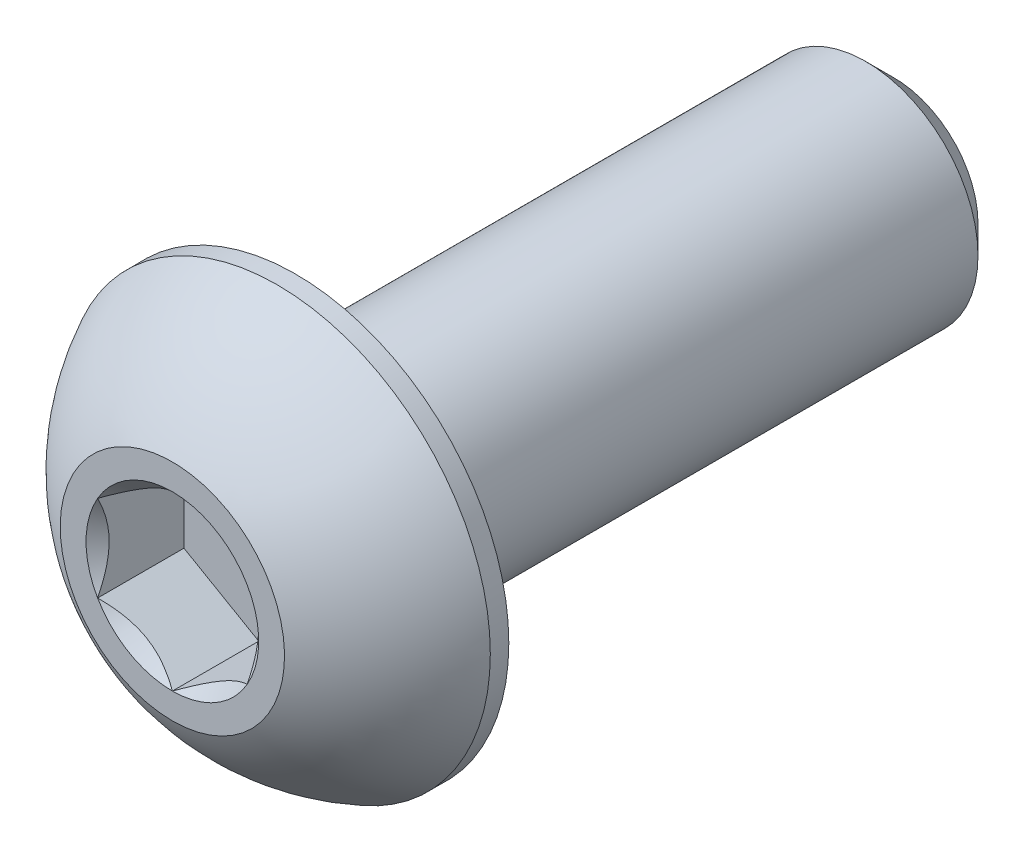
ISO-10303-21;
HEADER;
FILE_DESCRIPTION(('STEP AP214'),'2;1');
FILE_NAME('part.step','',(''),(''),'','','');
FILE_SCHEMA(('AUTOMOTIVE_DESIGN { 1 0 10303 214 1 1 1 1 }'));
ENDSEC;
DATA;
#1=APPLICATION_CONTEXT('core data for automotive mechanical design processes');
#2=APPLICATION_PROTOCOL_DEFINITION('international standard','automotive_design',2000,#1);
#3=PRODUCT_CONTEXT('',#1,'mechanical');
#4=PRODUCT('Part','Part','',(#3));
#5=PRODUCT_RELATED_PRODUCT_CATEGORY('part','',(#4));
#6=PRODUCT_DEFINITION_FORMATION('','',#4);
#7=PRODUCT_DEFINITION_CONTEXT('part definition',#1,'design');
#8=PRODUCT_DEFINITION('design','',#6,#7);
#9=PRODUCT_DEFINITION_SHAPE('','',#8);
#10=(LENGTH_UNIT() NAMED_UNIT(*) SI_UNIT(.MILLI.,.METRE.));
#11=(NAMED_UNIT(*) PLANE_ANGLE_UNIT() SI_UNIT($,.RADIAN.));
#12=(NAMED_UNIT(*) SI_UNIT($,.STERADIAN.) SOLID_ANGLE_UNIT());
#13=UNCERTAINTY_MEASURE_WITH_UNIT(LENGTH_MEASURE(1.E-05),#10,'distance_accuracy_value','');
#14=(GEOMETRIC_REPRESENTATION_CONTEXT(3) GLOBAL_UNCERTAINTY_ASSIGNED_CONTEXT((#13)) GLOBAL_UNIT_ASSIGNED_CONTEXT((#10,
#11,#12)) REPRESENTATION_CONTEXT('',''));
#15=CARTESIAN_POINT('',(0.,0.,0.));
#16=DIRECTION('',(0.,0.,1.));
#17=DIRECTION('',(1.,0.,0.));
#18=AXIS2_PLACEMENT_3D('',#15,#16,#17);
#19=CARTESIAN_POINT('',(0.,0.,-9.65000000000001));
#20=DIRECTION('',(0.,0.,1.));
#21=DIRECTION('',(1.,0.,0.));
#22=AXIS2_PLACEMENT_3D('',#19,#20,#21);
#23=PLANE('',#22);
#24=CARTESIAN_POINT('',(0.,0.,-9.65000000000001));
#25=DIRECTION('',(0.,0.,1.));
#26=DIRECTION('',(1.,0.,0.));
#27=AXIS2_PLACEMENT_3D('',#24,#25,#26);
#28=CIRCLE('',#27,1.12500000000003);
#29=CARTESIAN_POINT('',(1.12500000000003,0.,-9.65000000000001));
#30=VERTEX_POINT('',#29);
#31=EDGE_CURVE('E51',#30,#30,#28,.T.);
#32=ORIENTED_EDGE('',*,*,#31,.F.);
#33=EDGE_LOOP('',(#32));
#34=FACE_BOUND('',#33,.T.);
#35=ADVANCED_FACE('F38',(#34),#23,.F.);
#36=CARTESIAN_POINT('',(0.,0.,-9.65000000000001));
#37=DIRECTION('',(0.,0.,1.));
#38=DIRECTION('',(1.,0.,0.));
#39=AXIS2_PLACEMENT_3D('',#36,#37,#38);
#40=CONICAL_SURFACE('',#39,1.12500000000003,0.785398163397431);
#41=CARTESIAN_POINT('',(0.,0.,-9.27500000000001));
#42=DIRECTION('',(0.,0.,1.));
#43=DIRECTION('',(1.,0.,0.));
#44=AXIS2_PLACEMENT_3D('',#41,#42,#43);
#45=CIRCLE('',#44,1.50000000000002);
#46=CARTESIAN_POINT('',(1.50000000000002,0.,-9.27500000000001));
#47=VERTEX_POINT('',#46);
#48=EDGE_CURVE('E177',#47,#47,#45,.T.);
#49=ORIENTED_EDGE('',*,*,#48,.F.);
#50=EDGE_LOOP('',(#49));
#51=FACE_BOUND('',#50,.T.);
#52=ORIENTED_EDGE('',*,*,#31,.T.);
#53=EDGE_LOOP('',(#52));
#54=FACE_BOUND('',#53,.T.);
#55=ADVANCED_FACE('F182',(#51,#54),#40,.T.);
#56=CARTESIAN_POINT('',(0.,0.,0.));
#57=DIRECTION('',(0.,0.,1.));
#58=DIRECTION('',(1.,0.,0.));
#59=AXIS2_PLACEMENT_3D('',#56,#57,#58);
#60=CYLINDRICAL_SURFACE('',#59,1.50000000000002);
#61=CARTESIAN_POINT('',(0.,0.,-1.65));
#62=DIRECTION('',(0.,0.,1.));
#63=DIRECTION('',(1.,0.,0.));
#64=AXIS2_PLACEMENT_3D('',#61,#62,#63);
#65=CIRCLE('',#64,1.50000000000002);
#66=CARTESIAN_POINT('',(1.50000000000002,0.,-1.65));
#67=VERTEX_POINT('',#66);
#68=EDGE_CURVE('E174',#67,#67,#65,.T.);
#69=ORIENTED_EDGE('',*,*,#68,.F.);
#70=EDGE_LOOP('',(#69));
#71=FACE_BOUND('',#70,.T.);
#72=ORIENTED_EDGE('',*,*,#48,.T.);
#73=EDGE_LOOP('',(#72));
#74=FACE_BOUND('',#73,.T.);
#75=ADVANCED_FACE('F188',(#71,#74),#60,.T.);
#76=CARTESIAN_POINT('',(0.,-2.85,-1.65));
#77=DIRECTION('',(0.,0.,1.));
#78=DIRECTION('',(1.,0.,0.));
#79=AXIS2_PLACEMENT_3D('',#76,#77,#78);
#80=PLANE('',#79);
#81=CARTESIAN_POINT('',(0.,0.,-1.65));
#82=DIRECTION('',(0.,0.,1.));
#83=DIRECTION('',(1.,0.,0.));
#84=AXIS2_PLACEMENT_3D('',#81,#82,#83);
#85=CIRCLE('',#84,2.85);
#86=CARTESIAN_POINT('',(2.85,0.,-1.65));
#87=VERTEX_POINT('',#86);
#88=EDGE_CURVE('E168',#87,#87,#85,.T.);
#89=ORIENTED_EDGE('',*,*,#88,.F.);
#90=EDGE_LOOP('',(#89));
#91=FACE_BOUND('',#90,.T.);
#92=ORIENTED_EDGE('',*,*,#68,.T.);
#93=EDGE_LOOP('',(#92));
#94=FACE_BOUND('',#93,.T.);
#95=ADVANCED_FACE('F193',(#91,#94),#80,.F.);
#96=CARTESIAN_POINT('',(0.,0.,-2.79483288770053));
#97=DIRECTION('',(0.,0.,1.));
#98=DIRECTION('',(0.,-1.,0.));
#99=AXIS2_PLACEMENT_3D('',#96,#97,#98);
#100=SPHERICAL_SURFACE('',#99,3.17192226735975);
#101=CARTESIAN_POINT('',(0.,0.,0.));
#102=DIRECTION('',(0.,0.,1.));
#103=DIRECTION('',(1.,0.,0.));
#104=AXIS2_PLACEMENT_3D('',#101,#102,#103);
#105=CIRCLE('',#104,1.50000000000002);
#106=CARTESIAN_POINT('',(0.,-1.50000000000002,0.));
#107=VERTEX_POINT('',#106);
#108=EDGE_CURVE('E171',#107,#107,#105,.T.);
#109=CARTESIAN_POINT('',(0.,0.,-1.4025));
#110=DIRECTION('',(0.,0.,1.));
#111=DIRECTION('',(1.,0.,0.));
#112=AXIS2_PLACEMENT_3D('',#109,#110,#111);
#113=CIRCLE('',#112,2.85);
#114=CARTESIAN_POINT('',(0.,-2.85,-1.4025));
#115=VERTEX_POINT('',#114);
#116=EDGE_CURVE('E165',#115,#115,#113,.T.);
#117=CARTESIAN_POINT('',(0.,-1.50000000000002,0.));
#118=CARTESIAN_POINT('',(0.,-1.51816007989212,-0.009746569473365));
#119=CARTESIAN_POINT('',(0.,-1.53622513742982,-0.0196701847238474));
#120=CARTESIAN_POINT('',(0.,-1.57215840256596,-0.039867631129312));
#121=CARTESIAN_POINT('',(0.,-1.59002661016439,-0.0501414622842942));
#122=CARTESIAN_POINT('',(0.,-1.62555937019151,-0.0710354648490238));
#123=CARTESIAN_POINT('',(0.,-1.64322392262021,-0.0816556362587711));
#124=CARTESIAN_POINT('',(0.,-1.67834266450263,-0.103238276426968));
#125=CARTESIAN_POINT('',(0.,-1.69579685395637,-0.114200745185417));
#126=CARTESIAN_POINT('',(0.,-1.73048823664555,-0.136463816635607));
#127=CARTESIAN_POINT('',(0.,-1.747725429881,-0.147764419327348));
#128=CARTESIAN_POINT('',(0.,-1.78197627078177,-0.170699464187154));
#129=CARTESIAN_POINT('',(0.,-1.7989899184471,-0.18233390635522));
#130=CARTESIAN_POINT('',(0.,-1.83278720341136,-0.205932209546913));
#131=CARTESIAN_POINT('',(0.,-1.84957084071029,-0.217896070570541));
#132=CARTESIAN_POINT('',(0.,-1.88290172764637,-0.242148665498755));
#133=CARTESIAN_POINT('',(0.,-1.89944897728351,-0.254437399403342));
#134=CARTESIAN_POINT('',(0.,-1.9323008013937,-0.279335070725424));
#135=CARTESIAN_POINT('',(0.,-1.94860537586674,-0.291944008142921));
#136=CARTESIAN_POINT('',(0.,-1.98096565436366,-0.317477295441113));
#137=CARTESIAN_POINT('',(0.,-1.99702135838754,-0.330401645321808));
#138=CARTESIAN_POINT('',(0.,-2.02887779526297,-0.356560846652227));
#139=CARTESIAN_POINT('',(0.,-2.04467852811453,-0.36979569810195));
#140=CARTESIAN_POINT('',(0.,-2.07601901880465,-0.396570873693308));
#141=CARTESIAN_POINT('',(0.,-2.09155877664322,-0.410111197834944));
#142=CARTESIAN_POINT('',(0.,-2.12237141262986,-0.437492173862107));
#143=CARTESIAN_POINT('',(0.,-2.13764429077792,-0.451332825747635));
#144=CARTESIAN_POINT('',(0.,-2.16791736411296,-0.479309198198269));
#145=CARTESIAN_POINT('',(0.,-2.18291755929994,-0.493444918763376));
#146=CARTESIAN_POINT('',(0.,-2.21263956705415,-0.522006057390952));
#147=CARTESIAN_POINT('',(0.,-2.2273613796214,-0.53643147545342));
#148=CARTESIAN_POINT('',(0.,-2.25652102825521,-0.565566527816472));
#149=CARTESIAN_POINT('',(0.,-2.27095886432178,-0.580276162117056));
#150=CARTESIAN_POINT('',(0.,-2.2995450739765,-0.609974057702796));
#151=CARTESIAN_POINT('',(0.,-2.31369344756466,-0.624962318987953));
#152=CARTESIAN_POINT('',(0.,-2.34169535627252,-0.65521177341876));
#153=CARTESIAN_POINT('',(0.,-2.35554889139224,-0.670472966564411));
#154=CARTESIAN_POINT('',(0.,-2.38295585920366,-0.701262485885584));
#155=CARTESIAN_POINT('',(0.,-2.39650929189537,-0.716790812061106));
#156=CARTESIAN_POINT('',(0.,-2.42331090492182,-0.748108697108243));
#157=CARTESIAN_POINT('',(0.,-2.43655908525657,-0.763898255979859));
#158=CARTESIAN_POINT('',(0.,-2.46274515962755,-0.795732606824228));
#159=CARTESIAN_POINT('',(0.,-2.47568305366379,-0.811777398796981));
#160=CARTESIAN_POINT('',(0.,-2.50124363939651,-0.844116119267127));
#161=CARTESIAN_POINT('',(0.,-2.51386633109298,-0.86041004776452));
#162=CARTESIAN_POINT('',(0.,-2.53879171587279,-0.8932408500426));
#163=CARTESIAN_POINT('',(0.,-2.55109440895612,-0.909777723823287));
#164=CARTESIAN_POINT('',(0.,-2.57537512182785,-0.94308813311364));
#165=CARTESIAN_POINT('',(0.,-2.58735314161625,-0.959861668623306));
#166=CARTESIAN_POINT('',(0.,-2.61097995657956,-0.993639027894247));
#167=CARTESIAN_POINT('',(0.,-2.62262875175448,-1.01064285165552));
#168=CARTESIAN_POINT('',(0.,-2.64559269128199,-1.04487432644225));
#169=CARTESIAN_POINT('',(0.,-2.65690783563458,-1.06210197746771));
#170=CARTESIAN_POINT('',(0.,-2.67920017403639,-1.09677456077299));
#171=CARTESIAN_POINT('',(0.,-2.69017736808561,-1.11421949305282));
#172=CARTESIAN_POINT('',(0.,-2.711789634999,-1.14932001019995));
#173=CARTESIAN_POINT('',(0.,-2.72242470786316,-1.16697559506725));
#174=CARTESIAN_POINT('',(0.,-2.74334869082118,-1.20249070903943));
#175=CARTESIAN_POINT('',(0.,-2.75363760091502,-1.22035023814429));
#176=CARTESIAN_POINT('',(0.,-2.77386535089241,-1.25626645340824));
#177=CARTESIAN_POINT('',(0.,-2.78380419077596,-1.27432313956732));
#178=CARTESIAN_POINT('',(0.,-2.80332801615778,-1.31062681184411));
#179=CARTESIAN_POINT('',(0.,-2.81291300165605,-1.32887379796182));
#180=CARTESIAN_POINT('',(0.,-2.83172550494215,-1.3655511220839));
#181=CARTESIAN_POINT('',(0.,-2.84095302272998,-1.38398146008827));
#182=CARTESIAN_POINT('',(0.,-2.85,-1.4025));
#183=B_SPLINE_CURVE_WITH_KNOTS('',3,(#117,#118,#119,#120,#121,#122,#123,#124,#125,#126,#127,
#128,#129,#130,#131,#132,#133,#134,#135,#136,#137,#138,#139,#140,#141,#142,#143,#144,#145,#146,
#147,#148,#149,#150,#151,#152,#153,#154,#155,#156,#157,#158,#159,#160,#161,#162,#163,#164,#165,
#166,#167,#168,#169,#170,#171,#172,#173,#174,#175,#176,#177,#178,#179,#180,#181,#182),
.UNSPECIFIED.,.F.,.F.,(4,2,2,2,2,2,2,2,2,2,2,2,2,2,2,2,2,2,2,2,2,2,2,2,2,2,2,2,2,2,2,2,4),(0.,
0.061829894182698,0.123659788365395,0.185489682548094,0.247319576730792,0.30914947091349,
0.370979365096188,0.432809259278885,0.494639153461583,0.556469047644282,0.618298941826979,
0.680128836009677,0.741958730192375,0.803788624375073,0.865618518557771,0.927448412740469,
0.989278306923166,1.05110820110586,1.11293809528856,1.17476798947126,1.23659788365396,
1.29842777783666,1.36025767201935,1.42208756620205,1.48391746038475,1.54574735456745,
1.60757724875015,1.66940714293284,1.73123703711554,1.79306693129824,1.85489682548094,
1.91672671966364,1.97855661384633),.UNSPECIFIED.);
#184=EDGE_CURVE('BSEAM198',#107,#115,#183,.T.);
#185=ORIENTED_EDGE('',*,*,#108,.F.);
#186=ORIENTED_EDGE('',*,*,#116,.T.);
#187=ORIENTED_EDGE('',*,*,#184,.T.);
#188=ORIENTED_EDGE('',*,*,#184,.F.);
#189=EDGE_LOOP('',(#185,#187,#186,#188));
#190=FACE_BOUND('',#189,.T.);
#191=ADVANCED_FACE('F198',(#190),#100,.T.);
#192=CARTESIAN_POINT('',(0.,-1.50000000000002,0.));
#193=DIRECTION('',(0.,0.,-1.));
#194=DIRECTION('',(-1.,0.,0.));
#195=AXIS2_PLACEMENT_3D('',#192,#193,#194);
#196=PLANE('',#195);
#197=CARTESIAN_POINT('',(0.,0.,0.));
#198=DIRECTION('',(0.,0.,1.));
#199=DIRECTION('',(1.,0.,0.));
#200=AXIS2_PLACEMENT_3D('',#197,#198,#199);
#201=CIRCLE('',#200,1.15470053837925);
#202=CARTESIAN_POINT('',(-0.999999999999997,0.577350269189625,0.));
#203=VERTEX_POINT('',#202);
#204=CARTESIAN_POINT('',(-0.999999999999997,-0.577350269189627,0.));
#205=VERTEX_POINT('',#204);
#206=EDGE_CURVE('E64',#203,#205,#201,.T.);
#207=ORIENTED_EDGE('',*,*,#206,.F.);
#208=CARTESIAN_POINT('',(0.,1.15470053837925,0.));
#209=VERTEX_POINT('',#208);
#210=EDGE_CURVE('E136',#209,#203,#201,.T.);
#211=ORIENTED_EDGE('',*,*,#210,.F.);
#212=CARTESIAN_POINT('',(1.,0.57735026918962,0.));
#213=VERTEX_POINT('',#212);
#214=EDGE_CURVE('E133',#213,#209,#201,.T.);
#215=ORIENTED_EDGE('',*,*,#214,.F.);
#216=CARTESIAN_POINT('',(1.,-0.577350269189621,0.));
#217=VERTEX_POINT('',#216);
#218=EDGE_CURVE('E104',#217,#213,#201,.T.);
#219=ORIENTED_EDGE('',*,*,#218,.F.);
#220=CARTESIAN_POINT('',(0.,-1.15470053837925,0.));
#221=VERTEX_POINT('',#220);
#222=EDGE_CURVE('E96',#221,#217,#201,.T.);
#223=ORIENTED_EDGE('',*,*,#222,.F.);
#224=EDGE_CURVE('E57',#205,#221,#201,.T.);
#225=ORIENTED_EDGE('',*,*,#224,.F.);
#226=EDGE_LOOP('',(#207,#211,#215,#219,#223,#225));
#227=FACE_BOUND('',#226,.T.);
#228=ORIENTED_EDGE('',*,*,#108,.T.);
#229=EDGE_LOOP('',(#228));
#230=FACE_BOUND('',#229,.T.);
#231=ADVANCED_FACE('F130',(#227,#230),#196,.F.);
#232=CARTESIAN_POINT('',(0.,0.,0.));
#233=DIRECTION('',(0.,0.,1.));
#234=DIRECTION('',(1.,0.,0.));
#235=AXIS2_PLACEMENT_3D('',#232,#233,#234);
#236=CYLINDRICAL_SURFACE('',#235,2.85);
#237=ORIENTED_EDGE('',*,*,#116,.F.);
#238=EDGE_LOOP('',(#237));
#239=FACE_BOUND('',#238,.T.);
#240=ORIENTED_EDGE('',*,*,#88,.T.);
#241=EDGE_LOOP('',(#240));
#242=FACE_BOUND('',#241,.T.);
#243=ADVANCED_FACE('F204',(#239,#242),#236,.T.);
#244=CARTESIAN_POINT('',(0.,0.,0.));
#245=DIRECTION('',(0.,0.,1.));
#246=DIRECTION('',(1.,0.,0.));
#247=AXIS2_PLACEMENT_3D('',#244,#245,#246);
#248=CONICAL_SURFACE('',#247,1.15470053837925,0.78539816339745);
#249=ORIENTED_EDGE('',*,*,#218,.T.);
#250=CARTESIAN_POINT('',(1.,-1.15147208646461,0.370385677513857));
#251=CARTESIAN_POINT('',(1.,-1.12343447988551,0.349219919873708));
#252=CARTESIAN_POINT('',(1.,-1.09524064850696,0.328261692175906));
#253=CARTESIAN_POINT('',(1.,-1.03847715644375,0.286846022235618));
#254=CARTESIAN_POINT('',(1.,-1.00990740382974,0.266388706123655));
#255=CARTESIAN_POINT('',(1.,-0.92312089433347,0.205604794954506));
#256=CARTESIAN_POINT('',(1.,-0.864253173759053,0.166192228961395));
#257=CARTESIAN_POINT('',(1.,-0.74080985825804,0.0888206642002037));
#258=CARTESIAN_POINT('',(1.,-0.676100255137802,0.0510730391143415));
#259=CARTESIAN_POINT('',(1.,-0.54344893904912,-0.0179754124487081));
#260=CARTESIAN_POINT('',(1.,-0.475519112027775,-0.049297972153134));
#261=CARTESIAN_POINT('',(1.,-0.373555850333526,-0.0876182211162039));
#262=CARTESIAN_POINT('',(1.,-0.341031989670905,-0.0986164083578424));
#263=CARTESIAN_POINT('',(1.,-0.275199079052291,-0.118001657852638));
#264=CARTESIAN_POINT('',(1.,-0.24188997517393,-0.126388540223299));
#265=CARTESIAN_POINT('',(1.,-0.17524751704299,-0.139974779280982));
#266=CARTESIAN_POINT('',(1.,-0.141925568218173,-0.145229209232031));
#267=CARTESIAN_POINT('',(1.,-0.0749144362322771,-0.152451313429106));
#268=CARTESIAN_POINT('',(1.,-0.0412251978501601,-0.15441848638949));
#269=CARTESIAN_POINT('',(1.,0.0249580992634224,-0.154916801606837));
#270=CARTESIAN_POINT('',(1.,0.0574512826460405,-0.153569732111363));
#271=CARTESIAN_POINT('',(1.,0.122148505701868,-0.147783515501013));
#272=CARTESIAN_POINT('',(1.,0.154352610132927,-0.143345079338462));
#273=CARTESIAN_POINT('',(1.,0.21879989886764,-0.131543169854794));
#274=CARTESIAN_POINT('',(1.,0.251033743268954,-0.124129458961488));
#275=CARTESIAN_POINT('',(1.,0.314797132354919,-0.106771057501322));
#276=CARTESIAN_POINT('',(1.,0.346326735731005,-0.0968265787111677));
#277=CARTESIAN_POINT('',(1.,0.445594187730205,-0.0617765174456608));
#278=CARTESIAN_POINT('',(1.,0.511919139476036,-0.0326791416432731));
#279=CARTESIAN_POINT('',(1.,0.641453244657532,0.0320153296865072));
#280=CARTESIAN_POINT('',(1.,0.704650133126345,0.0676357767152442));
#281=CARTESIAN_POINT('',(1.,0.825428490174987,0.141123901346938));
#282=CARTESIAN_POINT('',(1.,0.883132947867685,0.178791947135466));
#283=CARTESIAN_POINT('',(1.,0.968148853704565,0.237022852943166));
#284=CARTESIAN_POINT('',(1.,0.996120570380285,0.256638475762859));
#285=CARTESIAN_POINT('',(1.,1.05168177729901,0.296388517061273));
#286=CARTESIAN_POINT('',(1.,1.079271369977,0.316522792198834));
#287=CARTESIAN_POINT('',(1.,1.10670185346329,0.336872119072974));
#288=B_SPLINE_CURVE_WITH_KNOTS('',3,(#250,#251,#252,#253,#254,#255,#256,#257,#258,#259,#260,
#261,#262,#263,#264,#265,#266,#267,#268,#269,#270,#271,#272,#273,#274,#275,#276,#277,#278,#279,
#280,#281,#282,#283,#284,#285,#286,#287),.UNSPECIFIED.,.F.,.F.,(4,2,2,2,2,2,2,2,2,2,2,2,2,2,2,2,
2,2,4),(0.,0.10538645908329,0.210799187330123,0.423233611565466,0.647793540908498,
0.871580877738603,0.974493074181413,1.077412358272,1.17846428203204,1.27953161415761,
1.37694086739609,1.47432772585407,1.57343322804292,1.6725304397285,1.88917353996826,
2.10660791038812,2.31323734249842,2.41572589232043,2.51818641476502),.UNSPECIFIED.);
#289=EDGE_CURVE('E11',#217,#213,#288,.T.);
#290=ORIENTED_EDGE('',*,*,#289,.F.);
#291=EDGE_LOOP('',(#249,#290));
#292=FACE_BOUND('',#291,.T.);
#293=ADVANCED_FACE('F108',(#292),#248,.F.);
#294=ORIENTED_EDGE('',*,*,#214,.T.);
#295=CARTESIAN_POINT('',(1.0002,0.577234799135786,0.000115487372616175));
#296=CARTESIAN_POINT('',(0.96581740499282,0.59708559961862,-0.0197220691742649));
#297=CARTESIAN_POINT('',(0.930859881860175,0.617268335009455,-0.0383949793611092));
#298=CARTESIAN_POINT('',(0.85957719704391,0.658423412276684,-0.0725852572768405));
#299=CARTESIAN_POINT('',(0.823245249471016,0.679399671988078,-0.0880835909765399));
#300=CARTESIAN_POINT('',(0.749983386196688,0.721697428470845,-0.114632692857734));
#301=CARTESIAN_POINT('',(0.713072148554585,0.743008141459635,-0.125750226003073));
#302=CARTESIAN_POINT('',(0.63843727068914,0.786098608286185,-0.142880134223817));
#303=CARTESIAN_POINT('',(0.600715911891363,0.80787704494228,-0.148905302533326));
#304=CARTESIAN_POINT('',(0.535707801582065,0.845409494928862,-0.154339445032505));
#305=CARTESIAN_POINT('',(0.508505628471827,0.8611146768966,-0.155143061683267));
#306=CARTESIAN_POINT('',(0.454153959330887,0.892494627706028,-0.153793300583112));
#307=CARTESIAN_POINT('',(0.427004476245123,0.908169389073952,-0.1516392704528));
#308=CARTESIAN_POINT('',(0.345943722673039,0.954969836969509,-0.140883027871528));
#309=CARTESIAN_POINT('',(0.292435859021572,0.985862616452446,-0.127985443584643));
#310=CARTESIAN_POINT('',(0.198523934856568,1.04008269114923,-0.0968592693978221));
#311=CARTESIAN_POINT('',(0.157679476328165,1.0636642502755,-0.0802622022981601));
#312=CARTESIAN_POINT('',(0.0775903626180563,1.10990372163519,-0.042875075314707));
#313=CARTESIAN_POINT('',(0.0383409891295625,1.1325643579843,-0.0220986581825966));
#314=CARTESIAN_POINT('',(-0.000199999999999514,1.15481600843309,0.000115487372613833));
#315=B_SPLINE_CURVE_WITH_KNOTS('',3,(#295,#296,#297,#298,#299,#300,#301,#302,#303,#304,#305,
#306,#307,#308,#309,#310,#311,#312,#313,#314),.UNSPECIFIED.,.F.,.F.,(4,2,2,2,2,2,2,2,2,4),(0.,
0.13323767682856,0.267252229834491,0.399137076269302,0.53068960328077,0.624814864263848,
0.718960890149135,0.907306626112099,1.05710100361789,1.20641411519286),.UNSPECIFIED.);
#316=EDGE_CURVE('E135',#213,#209,#315,.T.);
#317=ORIENTED_EDGE('',*,*,#316,.F.);
#318=EDGE_LOOP('',(#294,#317));
#319=FACE_BOUND('',#318,.T.);
#320=ADVANCED_FACE('F291',(#319),#248,.F.);
#321=ORIENTED_EDGE('',*,*,#210,.T.);
#322=CARTESIAN_POINT('',(0.000200000000000433,1.15481600843309,0.000115487372613877));
#323=CARTESIAN_POINT('',(-0.0341825950071802,1.13496520795025,-0.019722069174267));
#324=CARTESIAN_POINT('',(-0.0691401181398243,1.11478247255942,-0.0383949793611112));
#325=CARTESIAN_POINT('',(-0.140422802956089,1.07362739529219,-0.0725852572768422));
#326=CARTESIAN_POINT('',(-0.176754750528983,1.0526511355808,-0.0880835909765415));
#327=CARTESIAN_POINT('',(-0.25001661380331,1.01035337909803,-0.114632692857735));
#328=CARTESIAN_POINT('',(-0.286927851445413,0.989042666109238,-0.125750226003074));
#329=CARTESIAN_POINT('',(-0.361562729310858,0.945952199282689,-0.142880134223818));
#330=CARTESIAN_POINT('',(-0.399284088108635,0.924173762626594,-0.148905302533327));
#331=CARTESIAN_POINT('',(-0.464292198417932,0.886641312640012,-0.154339445032506));
#332=CARTESIAN_POINT('',(-0.491494371528171,0.870936130672273,-0.155143061683268));
#333=CARTESIAN_POINT('',(-0.54584604066911,0.839556179862846,-0.153793300583113));
#334=CARTESIAN_POINT('',(-0.572995523754874,0.823881418494921,-0.151639270452801));
#335=CARTESIAN_POINT('',(-0.654056277326958,0.777080970599365,-0.140883027871529));
#336=CARTESIAN_POINT('',(-0.707564140978425,0.746188191116428,-0.127985443584644));
#337=CARTESIAN_POINT('',(-0.801476065143429,0.691968116419648,-0.096859269397823));
#338=CARTESIAN_POINT('',(-0.842320523671832,0.66838655729337,-0.080262202298161));
#339=CARTESIAN_POINT('',(-0.922409637381941,0.62214708593368,-0.0428750753147078));
#340=CARTESIAN_POINT('',(-0.961659010870435,0.599486449584574,-0.0220986581825973));
#341=CARTESIAN_POINT('',(-1.0002,0.577234799135787,0.00011548737261326));
#342=B_SPLINE_CURVE_WITH_KNOTS('',3,(#322,#323,#324,#325,#326,#327,#328,#329,#330,#331,#332,
#333,#334,#335,#336,#337,#338,#339,#340,#341),.UNSPECIFIED.,.F.,.F.,(4,2,2,2,2,2,2,2,2,4),(0.,
0.133237676828559,0.26725222983449,0.399137076269299,0.530689603280767,0.624814864263845,
0.718960890149132,0.907306626112096,1.05710100361789,1.20641411519286),.UNSPECIFIED.);
#343=EDGE_CURVE('E140',#209,#203,#342,.T.);
#344=ORIENTED_EDGE('',*,*,#343,.F.);
#345=EDGE_LOOP('',(#321,#344));
#346=FACE_BOUND('',#345,.T.);
#347=ADVANCED_FACE('F143',(#346),#248,.F.);
#348=ORIENTED_EDGE('',*,*,#206,.T.);
#349=CARTESIAN_POINT('',(-0.999999999999996,-1.15147208646461,0.370385677513859));
#350=CARTESIAN_POINT('',(-0.999999999999996,-1.12343447988552,0.34921991987371));
#351=CARTESIAN_POINT('',(-0.999999999999996,-1.09524064850697,0.328261692175907));
#352=CARTESIAN_POINT('',(-0.999999999999996,-1.03847715644376,0.286846022235619));
#353=CARTESIAN_POINT('',(-0.999999999999996,-1.00990740382975,0.266388706123656));
#354=CARTESIAN_POINT('',(-0.999999999999996,-0.923120894333474,0.205604794954507));
#355=CARTESIAN_POINT('',(-0.999999999999997,-0.864253173759057,0.166192228961396));
#356=CARTESIAN_POINT('',(-0.999999999999997,-0.740809858258044,0.0888206642002033));
#357=CARTESIAN_POINT('',(-0.999999999999997,-0.676100255137805,0.0510730391143406));
#358=CARTESIAN_POINT('',(-0.999999999999997,-0.543448939049123,-0.0179754124487097));
#359=CARTESIAN_POINT('',(-0.999999999999997,-0.475519112027777,-0.049297972153136));
#360=CARTESIAN_POINT('',(-0.999999999999997,-0.373555850333528,-0.0876182211162064));
#361=CARTESIAN_POINT('',(-0.999999999999997,-0.341031989670907,-0.098616408357845));
#362=CARTESIAN_POINT('',(-0.999999999999997,-0.275199079052293,-0.118001657852641));
#363=CARTESIAN_POINT('',(-0.999999999999997,-0.241889975173932,-0.126388540223302));
#364=CARTESIAN_POINT('',(-0.999999999999997,-0.175247517042992,-0.139974779280985));
#365=CARTESIAN_POINT('',(-0.999999999999997,-0.141925568218175,-0.145229209232034));
#366=CARTESIAN_POINT('',(-0.999999999999997,-0.0749144362322791,-0.152451313429109));
#367=CARTESIAN_POINT('',(-0.999999999999997,-0.041225197850162,-0.154418486389493));
#368=CARTESIAN_POINT('',(-0.999999999999997,0.0249580992634205,-0.15491680160684));
#369=CARTESIAN_POINT('',(-0.999999999999997,0.0574512826460387,-0.153569732111367));
#370=CARTESIAN_POINT('',(-0.999999999999997,0.122148505701866,-0.147783515501016));
#371=CARTESIAN_POINT('',(-0.999999999999997,0.154352610132926,-0.143345079338466));
#372=CARTESIAN_POINT('',(-0.999999999999997,0.218799898867639,-0.131543169854798));
#373=CARTESIAN_POINT('',(-0.999999999999997,0.251033743268952,-0.124129458961492));
#374=CARTESIAN_POINT('',(-0.999999999999997,0.314797132354917,-0.106771057501326));
#375=CARTESIAN_POINT('',(-0.999999999999997,0.346326735731003,-0.0968265787111716));
#376=CARTESIAN_POINT('',(-0.999999999999997,0.445594187730203,-0.0617765174456648));
#377=CARTESIAN_POINT('',(-0.999999999999997,0.511919139476034,-0.0326791416432772));
#378=CARTESIAN_POINT('',(-0.999999999999997,0.641453244657529,0.0320153296865026));
#379=CARTESIAN_POINT('',(-0.999999999999997,0.704650133126341,0.0676357767152392));
#380=CARTESIAN_POINT('',(-0.999999999999997,0.825428490174983,0.141123901346932));
#381=CARTESIAN_POINT('',(-0.999999999999997,0.883132947867681,0.17879194713546));
#382=CARTESIAN_POINT('',(-0.999999999999997,0.968148853704561,0.23702285294316));
#383=CARTESIAN_POINT('',(-0.999999999999997,0.99612057038028,0.256638475762853));
#384=CARTESIAN_POINT('',(-0.999999999999997,1.05168177729901,0.296388517061267));
#385=CARTESIAN_POINT('',(-0.999999999999997,1.079271369977,0.316522792198828));
#386=CARTESIAN_POINT('',(-0.999999999999997,1.10670185346329,0.336872119072968));
#387=B_SPLINE_CURVE_WITH_KNOTS('',3,(#349,#350,#351,#352,#353,#354,#355,#356,#357,#358,#359,
#360,#361,#362,#363,#364,#365,#366,#367,#368,#369,#370,#371,#372,#373,#374,#375,#376,#377,#378,
#379,#380,#381,#382,#383,#384,#385,#386),.UNSPECIFIED.,.F.,.F.,(4,2,2,2,2,2,2,2,2,2,2,2,2,2,2,2,
2,2,4),(0.,0.10538645908329,0.210799187330124,0.423233611565468,0.647793540908502,
0.871580877738608,0.974493074181418,1.07741235827201,1.17846428203204,1.27953161415762,
1.3769408673961,1.47432772585407,1.57343322804293,1.67253043972851,1.88917353996827,
2.10660791038812,2.31323734249843,2.41572589232044,2.51818641476502),.UNSPECIFIED.);
#388=EDGE_CURVE('E147',#203,#205,#387,.F.);
#389=ORIENTED_EDGE('',*,*,#388,.F.);
#390=EDGE_LOOP('',(#348,#389));
#391=FACE_BOUND('',#390,.T.);
#392=ADVANCED_FACE('F285',(#391),#248,.F.);
#393=ORIENTED_EDGE('',*,*,#224,.T.);
#394=CARTESIAN_POINT('',(-1.0002,-0.577234799135786,0.000115487372612706));
#395=CARTESIAN_POINT('',(-0.965817404992816,-0.59708559961862,-0.0197220691742684));
#396=CARTESIAN_POINT('',(-0.930859881860172,-0.617268335009454,-0.0383949793611125));
#397=CARTESIAN_POINT('',(-0.859577197043907,-0.658423412276684,-0.0725852572768433));
#398=CARTESIAN_POINT('',(-0.823245249471013,-0.679399671988078,-0.0880835909765424));
#399=CARTESIAN_POINT('',(-0.749983386196686,-0.721697428470844,-0.114632692857736));
#400=CARTESIAN_POINT('',(-0.713072148554583,-0.743008141459635,-0.125750226003075));
#401=CARTESIAN_POINT('',(-0.638437270689138,-0.786098608286184,-0.142880134223819));
#402=CARTESIAN_POINT('',(-0.600715911891361,-0.807877044942279,-0.148905302533328));
#403=CARTESIAN_POINT('',(-0.535707801582064,-0.84540949492886,-0.154339445032507));
#404=CARTESIAN_POINT('',(-0.508505628471825,-0.861114676896599,-0.155143061683269));
#405=CARTESIAN_POINT('',(-0.454153959330885,-0.892494627706026,-0.153793300583114));
#406=CARTESIAN_POINT('',(-0.427004476245122,-0.908169389073951,-0.151639270452802));
#407=CARTESIAN_POINT('',(-0.345943722673037,-0.954969836969508,-0.14088302787153));
#408=CARTESIAN_POINT('',(-0.29243585902157,-0.985862616452444,-0.127985443584645));
#409=CARTESIAN_POINT('',(-0.198523934856567,-1.04008269114922,-0.0968592693978238));
#410=CARTESIAN_POINT('',(-0.157679476328164,-1.0636642502755,-0.0802622022981617));
#411=CARTESIAN_POINT('',(-0.0775903626180547,-1.10990372163519,-0.0428750753147082));
#412=CARTESIAN_POINT('',(-0.0383409891295607,-1.1325643579843,-0.0220986581825977));
#413=CARTESIAN_POINT('',(0.000200000000001427,-1.15481600843309,0.000115487372612954));
#414=B_SPLINE_CURVE_WITH_KNOTS('',3,(#394,#395,#396,#397,#398,#399,#400,#401,#402,#403,#404,
#405,#406,#407,#408,#409,#410,#411,#412,#413),.UNSPECIFIED.,.F.,.F.,(4,2,2,2,2,2,2,2,2,4),(0.,
0.133237676828559,0.26725222983449,0.399137076269299,0.530689603280767,0.624814864263845,
0.718960890149132,0.907306626112096,1.05710100361789,1.20641411519286),.UNSPECIFIED.);
#415=EDGE_CURVE('E120',#205,#221,#414,.T.);
#416=ORIENTED_EDGE('',*,*,#415,.F.);
#417=EDGE_LOOP('',(#393,#416));
#418=FACE_BOUND('',#417,.T.);
#419=ADVANCED_FACE('F233',(#418),#248,.F.);
#420=ORIENTED_EDGE('',*,*,#222,.T.);
#421=CARTESIAN_POINT('',(-0.000199999999998591,-1.15481600843309,0.00011548737261301));
#422=CARTESIAN_POINT('',(0.0341825950071819,-1.13496520795025,-0.0197220691742678));
#423=CARTESIAN_POINT('',(0.0691401181398259,-1.11478247255942,-0.0383949793611118));
#424=CARTESIAN_POINT('',(0.14042280295609,-1.07362739529219,-0.0725852572768426));
#425=CARTESIAN_POINT('',(0.176754750528985,-1.05265113558079,-0.0880835909765418));
#426=CARTESIAN_POINT('',(0.250016613803312,-1.01035337909803,-0.114632692857735));
#427=CARTESIAN_POINT('',(0.286927851445415,-0.989042666109238,-0.125750226003074));
#428=CARTESIAN_POINT('',(0.361562729310859,-0.945952199282688,-0.142880134223818));
#429=CARTESIAN_POINT('',(0.399284088108636,-0.924173762626594,-0.148905302533327));
#430=CARTESIAN_POINT('',(0.464292198417933,-0.886641312640012,-0.154339445032506));
#431=CARTESIAN_POINT('',(0.491494371528172,-0.870936130672273,-0.155143061683268));
#432=CARTESIAN_POINT('',(0.545846040669111,-0.839556179862846,-0.153793300583113));
#433=CARTESIAN_POINT('',(0.572995523754875,-0.823881418494921,-0.151639270452801));
#434=CARTESIAN_POINT('',(0.654056277326959,-0.777080970599364,-0.140883027871529));
#435=CARTESIAN_POINT('',(0.707564140978426,-0.746188191116428,-0.127985443584645));
#436=CARTESIAN_POINT('',(0.801476065143431,-0.691968116419647,-0.0968592693978229));
#437=CARTESIAN_POINT('',(0.842320523671833,-0.668386557293369,-0.0802622022981606));
#438=CARTESIAN_POINT('',(0.922409637381943,-0.622147085933678,-0.0428750753147068));
#439=CARTESIAN_POINT('',(0.961659010870437,-0.599486449584572,-0.022098658182596));
#440=CARTESIAN_POINT('',(1.0002,-0.577234799135784,0.00011548737261471));
#441=B_SPLINE_CURVE_WITH_KNOTS('',3,(#421,#422,#423,#424,#425,#426,#427,#428,#429,#430,#431,
#432,#433,#434,#435,#436,#437,#438,#439,#440),.UNSPECIFIED.,.F.,.F.,(4,2,2,2,2,2,2,2,2,4),(0.,
0.133237676828559,0.267252229834489,0.399137076269299,0.530689603280766,0.624814864263844,
0.71896089014913,0.907306626112094,1.05710100361789,1.20641411519286),.UNSPECIFIED.);
#442=EDGE_CURVE('E100',#221,#217,#441,.T.);
#443=ORIENTED_EDGE('',*,*,#442,.F.);
#444=EDGE_LOOP('',(#420,#443));
#445=FACE_BOUND('',#444,.T.);
#446=ADVANCED_FACE('F98',(#445),#248,.F.);
#447=CARTESIAN_POINT('',(1.,-0.577350269189622,-1.155));
#448=DIRECTION('',(0.,0.,1.));
#449=DIRECTION('',(1.,0.,0.));
#450=AXIS2_PLACEMENT_3D('',#447,#448,#449);
#451=PLANE('',#450);
#452=DIRECTION('',(0.866025403784438,0.5,0.));
#453=VECTOR('',#452,1.);
#454=CARTESIAN_POINT('',(0.,-1.15470053837925,-1.155));
#455=LINE('',#454,#453);
#456=CARTESIAN_POINT('',(0.,-1.15470053837925,-1.155));
#457=VERTEX_POINT('',#456);
#458=CARTESIAN_POINT('',(1.,-0.577350269189622,-1.155));
#459=VERTEX_POINT('',#458);
#460=EDGE_CURVE('E119',#457,#459,#455,.T.);
#461=ORIENTED_EDGE('',*,*,#460,.T.);
#462=DIRECTION('',(0.,1.,0.));
#463=VECTOR('',#462,1.);
#464=CARTESIAN_POINT('',(1.,-0.577350269189622,-1.155));
#465=LINE('',#464,#463);
#466=CARTESIAN_POINT('',(1.,0.577350269189624,-1.155));
#467=VERTEX_POINT('',#466);
#468=EDGE_CURVE('E124',#459,#467,#465,.T.);
#469=ORIENTED_EDGE('',*,*,#468,.T.);
#470=DIRECTION('',(-0.866025403784439,0.499999999999999,0.));
#471=VECTOR('',#470,1.);
#472=CARTESIAN_POINT('',(1.,0.577350269189624,-1.155));
#473=LINE('',#472,#471);
#474=CARTESIAN_POINT('',(0.,1.15470053837925,-1.155));
#475=VERTEX_POINT('',#474);
#476=EDGE_CURVE('E275',#467,#475,#473,.T.);
#477=ORIENTED_EDGE('',*,*,#476,.T.);
#478=DIRECTION('',(-0.866025403784439,-0.5,0.));
#479=VECTOR('',#478,1.);
#480=CARTESIAN_POINT('',(0.,1.15470053837925,-1.155));
#481=LINE('',#480,#479);
#482=CARTESIAN_POINT('',(-0.999999999999997,0.577350269189625,-1.155));
#483=VERTEX_POINT('',#482);
#484=EDGE_CURVE('E156',#475,#483,#481,.T.);
#485=ORIENTED_EDGE('',*,*,#484,.T.);
#486=DIRECTION('',(0.,-1.,0.));
#487=VECTOR('',#486,1.);
#488=CARTESIAN_POINT('',(-0.999999999999997,0.577350269189625,-1.155));
#489=LINE('',#488,#487);
#490=CARTESIAN_POINT('',(-0.999999999999997,-0.577350269189624,-1.155));
#491=VERTEX_POINT('',#490);
#492=EDGE_CURVE('E279',#483,#491,#489,.T.);
#493=ORIENTED_EDGE('',*,*,#492,.T.);
#494=DIRECTION('',(0.866025403784439,-0.5,0.));
#495=VECTOR('',#494,1.);
#496=CARTESIAN_POINT('',(-0.999999999999997,-0.577350269189624,-1.155));
#497=LINE('',#496,#495);
#498=EDGE_CURVE('E127',#491,#457,#497,.T.);
#499=ORIENTED_EDGE('',*,*,#498,.T.);
#500=EDGE_LOOP('',(#461,#469,#477,#485,#493,#499));
#501=FACE_BOUND('',#500,.T.);
#502=ADVANCED_FACE('F232',(#501),#451,.T.);
#503=CARTESIAN_POINT('',(1.,-0.577350269189622,-1.155));
#504=DIRECTION('',(1.,0.,0.));
#505=DIRECTION('',(0.,1.,0.));
#506=AXIS2_PLACEMENT_3D('',#503,#504,#505);
#507=PLANE('',#506);
#508=DIRECTION('',(0.,0.,1.));
#509=VECTOR('',#508,1.);
#510=CARTESIAN_POINT('',(1.,-0.577350269189622,-1.155));
#511=LINE('',#510,#509);
#512=EDGE_CURVE('E116',#459,#217,#511,.T.);
#513=ORIENTED_EDGE('',*,*,#512,.T.);
#514=ORIENTED_EDGE('',*,*,#289,.T.);
#515=DIRECTION('',(0.,0.,1.));
#516=VECTOR('',#515,1.);
#517=CARTESIAN_POINT('',(1.,0.577350269189624,-1.155));
#518=LINE('',#517,#516);
#519=EDGE_CURVE('E126',#467,#213,#518,.T.);
#520=ORIENTED_EDGE('',*,*,#519,.F.);
#521=ORIENTED_EDGE('',*,*,#468,.F.);
#522=EDGE_LOOP('',(#513,#514,#520,#521));
#523=FACE_BOUND('',#522,.T.);
#524=ADVANCED_FACE('F122',(#523),#507,.F.);
#525=CARTESIAN_POINT('',(1.,0.577350269189624,-1.155));
#526=DIRECTION('',(0.499999999999999,0.866025403784439,0.));
#527=DIRECTION('',(-0.866025403784439,0.499999999999999,0.));
#528=AXIS2_PLACEMENT_3D('',#525,#526,#527);
#529=PLANE('',#528);
#530=ORIENTED_EDGE('',*,*,#519,.T.);
#531=ORIENTED_EDGE('',*,*,#316,.T.);
#532=DIRECTION('',(0.,0.,1.));
#533=VECTOR('',#532,1.);
#534=CARTESIAN_POINT('',(0.,1.15470053837925,-1.155));
#535=LINE('',#534,#533);
#536=EDGE_CURVE('E152',#475,#209,#535,.T.);
#537=ORIENTED_EDGE('',*,*,#536,.F.);
#538=ORIENTED_EDGE('',*,*,#476,.F.);
#539=EDGE_LOOP('',(#530,#531,#537,#538));
#540=FACE_BOUND('',#539,.T.);
#541=ADVANCED_FACE('F150',(#540),#529,.F.);
#542=CARTESIAN_POINT('',(0.,1.15470053837925,-1.155));
#543=DIRECTION('',(-0.5,0.866025403784439,0.));
#544=DIRECTION('',(-0.866025403784439,-0.5,0.));
#545=AXIS2_PLACEMENT_3D('',#542,#543,#544);
#546=PLANE('',#545);
#547=ORIENTED_EDGE('',*,*,#536,.T.);
#548=ORIENTED_EDGE('',*,*,#343,.T.);
#549=DIRECTION('',(0.,0.,1.));
#550=VECTOR('',#549,1.);
#551=CARTESIAN_POINT('',(-0.999999999999997,0.577350269189625,-1.155));
#552=LINE('',#551,#550);
#553=EDGE_CURVE('E158',#483,#203,#552,.T.);
#554=ORIENTED_EDGE('',*,*,#553,.F.);
#555=ORIENTED_EDGE('',*,*,#484,.F.);
#556=EDGE_LOOP('',(#547,#548,#554,#555));
#557=FACE_BOUND('',#556,.T.);
#558=ADVANCED_FACE('F154',(#557),#546,.F.);
#559=CARTESIAN_POINT('',(-0.999999999999997,0.577350269189625,-1.155));
#560=DIRECTION('',(-1.,0.,0.));
#561=DIRECTION('',(0.,-1.,0.));
#562=AXIS2_PLACEMENT_3D('',#559,#560,#561);
#563=PLANE('',#562);
#564=ORIENTED_EDGE('',*,*,#553,.T.);
#565=ORIENTED_EDGE('',*,*,#388,.T.);
#566=DIRECTION('',(0.,0.,1.));
#567=VECTOR('',#566,1.);
#568=CARTESIAN_POINT('',(-0.999999999999997,-0.577350269189624,-1.155));
#569=LINE('',#568,#567);
#570=EDGE_CURVE('E160',#491,#205,#569,.T.);
#571=ORIENTED_EDGE('',*,*,#570,.F.);
#572=ORIENTED_EDGE('',*,*,#492,.F.);
#573=EDGE_LOOP('',(#564,#565,#571,#572));
#574=FACE_BOUND('',#573,.T.);
#575=ADVANCED_FACE('F254',(#574),#563,.F.);
#576=CARTESIAN_POINT('',(-0.999999999999997,-0.577350269189624,-1.155));
#577=DIRECTION('',(-0.5,-0.866025403784439,0.));
#578=DIRECTION('',(0.866025403784439,-0.5,0.));
#579=AXIS2_PLACEMENT_3D('',#576,#577,#578);
#580=PLANE('',#579);
#581=ORIENTED_EDGE('',*,*,#570,.T.);
#582=ORIENTED_EDGE('',*,*,#415,.T.);
#583=DIRECTION('',(0.,0.,1.));
#584=VECTOR('',#583,1.);
#585=CARTESIAN_POINT('',(0.,-1.15470053837925,-1.155));
#586=LINE('',#585,#584);
#587=EDGE_CURVE('E118',#457,#221,#586,.T.);
#588=ORIENTED_EDGE('',*,*,#587,.F.);
#589=ORIENTED_EDGE('',*,*,#498,.F.);
#590=EDGE_LOOP('',(#581,#582,#588,#589));
#591=FACE_BOUND('',#590,.T.);
#592=ADVANCED_FACE('F213',(#591),#580,.F.);
#593=CARTESIAN_POINT('',(0.,-1.15470053837925,-1.155));
#594=DIRECTION('',(0.500000000000001,-0.866025403784438,0.));
#595=DIRECTION('',(0.866025403784438,0.500000000000001,0.));
#596=AXIS2_PLACEMENT_3D('',#593,#594,#595);
#597=PLANE('',#596);
#598=ORIENTED_EDGE('',*,*,#587,.T.);
#599=ORIENTED_EDGE('',*,*,#442,.T.);
#600=ORIENTED_EDGE('',*,*,#512,.F.);
#601=ORIENTED_EDGE('',*,*,#460,.F.);
#602=EDGE_LOOP('',(#598,#599,#600,#601));
#603=FACE_BOUND('',#602,.T.);
#604=ADVANCED_FACE('F114',(#603),#597,.F.);
#605=CLOSED_SHELL('',(#35,#55,#75,#95,#191,#231,#243,#293,#320,#347,#392,#419,#446,#502,#524,
#541,#558,#575,#592,#604));
#606=MANIFOLD_SOLID_BREP('B2',#605);
#607=ADVANCED_BREP_SHAPE_REPRESENTATION('',(#18,#606),#14);
#608=SHAPE_DEFINITION_REPRESENTATION(#9,#607);
ENDSEC;
END-ISO-10303-21;
